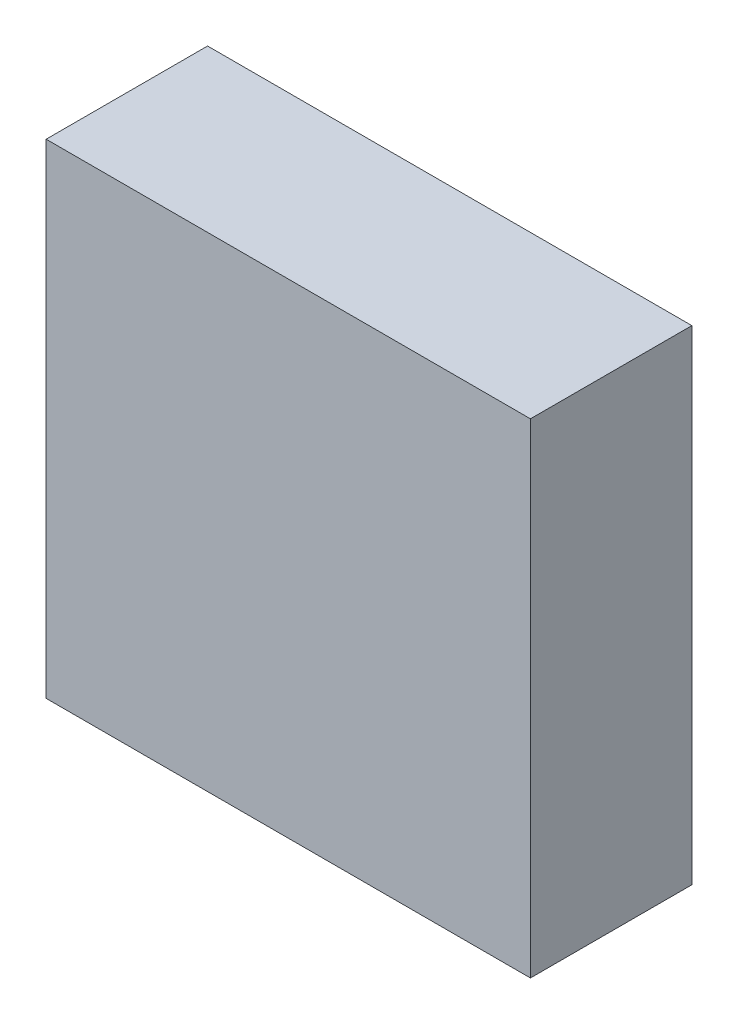
ISO-10303-21;
HEADER;
FILE_DESCRIPTION(('STEP AP214'),'2;1');
FILE_NAME('part.step','',(''),(''),'','','');
FILE_SCHEMA(('AUTOMOTIVE_DESIGN { 1 0 10303 214 1 1 1 1 }'));
ENDSEC;
DATA;
#1=APPLICATION_CONTEXT('core data for automotive mechanical design processes');
#2=APPLICATION_PROTOCOL_DEFINITION('international standard','automotive_design',2000,#1);
#3=PRODUCT_CONTEXT('',#1,'mechanical');
#4=PRODUCT('Part','Part','',(#3));
#5=PRODUCT_RELATED_PRODUCT_CATEGORY('part','',(#4));
#6=PRODUCT_DEFINITION_FORMATION('','',#4);
#7=PRODUCT_DEFINITION_CONTEXT('part definition',#1,'design');
#8=PRODUCT_DEFINITION('design','',#6,#7);
#9=PRODUCT_DEFINITION_SHAPE('','',#8);
#10=(LENGTH_UNIT() NAMED_UNIT(*) SI_UNIT(.MILLI.,.METRE.));
#11=(NAMED_UNIT(*) PLANE_ANGLE_UNIT() SI_UNIT($,.RADIAN.));
#12=(NAMED_UNIT(*) SI_UNIT($,.STERADIAN.) SOLID_ANGLE_UNIT());
#13=UNCERTAINTY_MEASURE_WITH_UNIT(LENGTH_MEASURE(1.E-05),#10,'distance_accuracy_value','');
#14=(GEOMETRIC_REPRESENTATION_CONTEXT(3) GLOBAL_UNCERTAINTY_ASSIGNED_CONTEXT((#13)) GLOBAL_UNIT_ASSIGNED_CONTEXT((#10,
#11,#12)) REPRESENTATION_CONTEXT('',''));
#15=CARTESIAN_POINT('',(0.,0.,0.));
#16=DIRECTION('',(0.,0.,1.));
#17=DIRECTION('',(1.,0.,0.));
#18=AXIS2_PLACEMENT_3D('',#15,#16,#17);
#19=CARTESIAN_POINT('',(-15.,80.,-15.));
#20=DIRECTION('',(1.,0.,0.));
#21=DIRECTION('',(0.,0.,-1.));
#22=AXIS2_PLACEMENT_3D('',#19,#20,#21);
#23=PLANE('',#22);
#24=DIRECTION('',(0.,-1.,0.));
#25=VECTOR('',#24,1.);
#26=CARTESIAN_POINT('',(-15.,80.,-15.));
#27=LINE('',#26,#25);
#28=CARTESIAN_POINT('',(-15.,85.,-15.));
#29=VERTEX_POINT('',#28);
#30=CARTESIAN_POINT('',(-15.,-5.,-15.));
#31=VERTEX_POINT('',#30);
#32=EDGE_CURVE('E202',#29,#31,#27,.T.);
#33=ORIENTED_EDGE('',*,*,#32,.T.);
#34=DIRECTION('',(0.,0.,-1.));
#35=VECTOR('',#34,1.);
#36=CARTESIAN_POINT('',(-15.,-5.,-15.));
#37=LINE('',#36,#35);
#38=CARTESIAN_POINT('',(-15.,-5.,15.));
#39=VERTEX_POINT('',#38);
#40=EDGE_CURVE('E166',#39,#31,#37,.T.);
#41=ORIENTED_EDGE('',*,*,#40,.F.);
#42=DIRECTION('',(0.,-1.,0.));
#43=VECTOR('',#42,1.);
#44=CARTESIAN_POINT('',(-15.,80.,15.));
#45=LINE('',#44,#43);
#46=CARTESIAN_POINT('',(-15.,85.,15.));
#47=VERTEX_POINT('',#46);
#48=EDGE_CURVE('E208',#47,#39,#45,.T.);
#49=ORIENTED_EDGE('',*,*,#48,.F.);
#50=DIRECTION('',(0.,0.,1.));
#51=VECTOR('',#50,1.);
#52=CARTESIAN_POINT('',(-15.,85.,-15.));
#53=LINE('',#52,#51);
#54=EDGE_CURVE('E172',#29,#47,#53,.T.);
#55=ORIENTED_EDGE('',*,*,#54,.F.);
#56=EDGE_LOOP('',(#33,#41,#49,#55));
#57=FACE_BOUND('',#56,.T.);
#58=ADVANCED_FACE('F38',(#57),#23,.F.);
#59=CARTESIAN_POINT('',(-15.,80.,15.));
#60=DIRECTION('',(0.,0.,-1.));
#61=DIRECTION('',(-1.,0.,0.));
#62=AXIS2_PLACEMENT_3D('',#59,#60,#61);
#63=PLANE('',#62);
#64=ORIENTED_EDGE('',*,*,#48,.T.);
#65=DIRECTION('',(-1.,0.,0.));
#66=VECTOR('',#65,1.);
#67=CARTESIAN_POINT('',(75.,-5.,15.));
#68=LINE('',#67,#66);
#69=CARTESIAN_POINT('',(75.,-5.,15.));
#70=VERTEX_POINT('',#69);
#71=EDGE_CURVE('E163',#70,#39,#68,.T.);
#72=ORIENTED_EDGE('',*,*,#71,.F.);
#73=DIRECTION('',(0.,-1.,0.));
#74=VECTOR('',#73,1.);
#75=CARTESIAN_POINT('',(75.,80.,15.));
#76=LINE('',#75,#74);
#77=CARTESIAN_POINT('',(75.,85.,15.));
#78=VERTEX_POINT('',#77);
#79=EDGE_CURVE('E206',#78,#70,#76,.T.);
#80=ORIENTED_EDGE('',*,*,#79,.F.);
#81=DIRECTION('',(1.,0.,0.));
#82=VECTOR('',#81,1.);
#83=CARTESIAN_POINT('',(-15.,85.,15.));
#84=LINE('',#83,#82);
#85=EDGE_CURVE('E175',#47,#78,#84,.T.);
#86=ORIENTED_EDGE('',*,*,#85,.F.);
#87=EDGE_LOOP('',(#64,#72,#80,#86));
#88=FACE_BOUND('',#87,.T.);
#89=ADVANCED_FACE('F274',(#88),#63,.F.);
#90=CARTESIAN_POINT('',(75.,80.,-15.));
#91=DIRECTION('',(-1.,0.,0.));
#92=DIRECTION('',(0.,0.,1.));
#93=AXIS2_PLACEMENT_3D('',#90,#91,#92);
#94=PLANE('',#93);
#95=ORIENTED_EDGE('',*,*,#79,.T.);
#96=DIRECTION('',(0.,0.,1.));
#97=VECTOR('',#96,1.);
#98=CARTESIAN_POINT('',(75.,-5.,-15.));
#99=LINE('',#98,#97);
#100=CARTESIAN_POINT('',(75.,-5.,-15.));
#101=VERTEX_POINT('',#100);
#102=EDGE_CURVE('E160',#101,#70,#99,.T.);
#103=ORIENTED_EDGE('',*,*,#102,.F.);
#104=DIRECTION('',(0.,-1.,0.));
#105=VECTOR('',#104,1.);
#106=CARTESIAN_POINT('',(75.,80.,-15.));
#107=LINE('',#106,#105);
#108=CARTESIAN_POINT('',(75.,85.,-15.));
#109=VERTEX_POINT('',#108);
#110=EDGE_CURVE('E204',#109,#101,#107,.T.);
#111=ORIENTED_EDGE('',*,*,#110,.F.);
#112=DIRECTION('',(0.,0.,-1.));
#113=VECTOR('',#112,1.);
#114=CARTESIAN_POINT('',(75.,85.,-15.));
#115=LINE('',#114,#113);
#116=EDGE_CURVE('E178',#78,#109,#115,.T.);
#117=ORIENTED_EDGE('',*,*,#116,.F.);
#118=EDGE_LOOP('',(#95,#103,#111,#117));
#119=FACE_BOUND('',#118,.T.);
#120=ADVANCED_FACE('F280',(#119),#94,.F.);
#121=CARTESIAN_POINT('',(-15.,80.,-15.));
#122=DIRECTION('',(0.,0.,1.));
#123=DIRECTION('',(1.,0.,0.));
#124=AXIS2_PLACEMENT_3D('',#121,#122,#123);
#125=PLANE('',#124);
#126=DIRECTION('',(-1.,0.,0.));
#127=VECTOR('',#126,1.);
#128=CARTESIAN_POINT('',(70.585,3.,-15.));
#129=LINE('',#128,#127);
#130=CARTESIAN_POINT('',(70.585,3.,-15.));
#131=VERTEX_POINT('',#130);
#132=CARTESIAN_POINT('',(-10.585,3.,-15.));
#133=VERTEX_POINT('',#132);
#134=EDGE_CURVE('E131',#131,#133,#129,.T.);
#135=ORIENTED_EDGE('',*,*,#134,.F.);
#136=DIRECTION('',(0.,-1.,0.));
#137=VECTOR('',#136,1.);
#138=CARTESIAN_POINT('',(70.585,3.,-15.));
#139=LINE('',#138,#137);
#140=CARTESIAN_POINT('',(70.585,77.,-15.));
#141=VERTEX_POINT('',#140);
#142=EDGE_CURVE('E52',#141,#131,#139,.T.);
#143=ORIENTED_EDGE('',*,*,#142,.F.);
#144=DIRECTION('',(1.,0.,0.));
#145=VECTOR('',#144,1.);
#146=CARTESIAN_POINT('',(70.585,77.,-15.));
#147=LINE('',#146,#145);
#148=CARTESIAN_POINT('',(-10.585,77.,-15.));
#149=VERTEX_POINT('',#148);
#150=EDGE_CURVE('E235',#149,#141,#147,.T.);
#151=ORIENTED_EDGE('',*,*,#150,.F.);
#152=DIRECTION('',(0.,1.,0.));
#153=VECTOR('',#152,1.);
#154=CARTESIAN_POINT('',(-10.585,3.,-15.));
#155=LINE('',#154,#153);
#156=EDGE_CURVE('E240',#133,#149,#155,.T.);
#157=ORIENTED_EDGE('',*,*,#156,.F.);
#158=EDGE_LOOP('',(#135,#143,#151,#157));
#159=FACE_BOUND('',#158,.T.);
#160=ORIENTED_EDGE('',*,*,#110,.T.);
#161=DIRECTION('',(1.,0.,0.));
#162=VECTOR('',#161,1.);
#163=CARTESIAN_POINT('',(75.,-5.,-15.));
#164=LINE('',#163,#162);
#165=EDGE_CURVE('E169',#31,#101,#164,.T.);
#166=ORIENTED_EDGE('',*,*,#165,.F.);
#167=ORIENTED_EDGE('',*,*,#32,.F.);
#168=DIRECTION('',(-1.,0.,0.));
#169=VECTOR('',#168,1.);
#170=CARTESIAN_POINT('',(-15.,85.,-15.));
#171=LINE('',#170,#169);
#172=EDGE_CURVE('E181',#109,#29,#171,.T.);
#173=ORIENTED_EDGE('',*,*,#172,.F.);
#174=EDGE_LOOP('',(#160,#166,#167,#173));
#175=FACE_BOUND('',#174,.T.);
#176=ADVANCED_FACE('F258',(#159,#175),#125,.F.);
#177=CARTESIAN_POINT('',(0.,85.,0.));
#178=DIRECTION('',(0.,1.,0.));
#179=DIRECTION('',(0.,0.,1.));
#180=AXIS2_PLACEMENT_3D('',#177,#178,#179);
#181=PLANE('',#180);
#182=ORIENTED_EDGE('',*,*,#54,.T.);
#183=ORIENTED_EDGE('',*,*,#85,.T.);
#184=ORIENTED_EDGE('',*,*,#116,.T.);
#185=ORIENTED_EDGE('',*,*,#172,.T.);
#186=EDGE_LOOP('',(#182,#183,#184,#185));
#187=FACE_BOUND('',#186,.T.);
#188=ADVANCED_FACE('F292',(#187),#181,.T.);
#189=CARTESIAN_POINT('',(0.,-5.,0.));
#190=DIRECTION('',(0.,-1.,0.));
#191=DIRECTION('',(0.,0.,-1.));
#192=AXIS2_PLACEMENT_3D('',#189,#190,#191);
#193=PLANE('',#192);
#194=ORIENTED_EDGE('',*,*,#102,.T.);
#195=ORIENTED_EDGE('',*,*,#71,.T.);
#196=ORIENTED_EDGE('',*,*,#40,.T.);
#197=ORIENTED_EDGE('',*,*,#165,.T.);
#198=EDGE_LOOP('',(#194,#195,#196,#197));
#199=FACE_BOUND('',#198,.T.);
#200=ADVANCED_FACE('F269',(#199),#193,.T.);
#201=CARTESIAN_POINT('',(0.,0.,0.));
#202=DIRECTION('',(0.,0.,1.));
#203=DIRECTION('',(1.,0.,0.));
#204=AXIS2_PLACEMENT_3D('',#201,#202,#203);
#205=PLANE('',#204);
#206=DIRECTION('',(0.,-1.,0.));
#207=VECTOR('',#206,1.);
#208=CARTESIAN_POINT('',(10.585,80.,0.));
#209=LINE('',#208,#207);
#210=CARTESIAN_POINT('',(10.585,3.,0.));
#211=VERTEX_POINT('',#210);
#212=CARTESIAN_POINT('',(10.585,77.,0.));
#213=VERTEX_POINT('',#212);
#214=EDGE_CURVE('E149',#211,#213,#209,.F.);
#215=ORIENTED_EDGE('',*,*,#214,.T.);
#216=DIRECTION('',(1.,0.,0.));
#217=VECTOR('',#216,1.);
#218=CARTESIAN_POINT('',(70.585,77.,0.));
#219=LINE('',#218,#217);
#220=CARTESIAN_POINT('',(19.415,77.,0.));
#221=VERTEX_POINT('',#220);
#222=EDGE_CURVE('E220',#213,#221,#219,.T.);
#223=ORIENTED_EDGE('',*,*,#222,.T.);
#224=DIRECTION('',(0.,-1.,0.));
#225=VECTOR('',#224,1.);
#226=CARTESIAN_POINT('',(19.415,80.,0.));
#227=LINE('',#226,#225);
#228=CARTESIAN_POINT('',(19.415,3.,0.));
#229=VERTEX_POINT('',#228);
#230=EDGE_CURVE('E11',#221,#229,#227,.T.);
#231=ORIENTED_EDGE('',*,*,#230,.T.);
#232=DIRECTION('',(-1.,0.,0.));
#233=VECTOR('',#232,1.);
#234=CARTESIAN_POINT('',(70.585,3.,0.));
#235=LINE('',#234,#233);
#236=EDGE_CURVE('E59',#229,#211,#235,.T.);
#237=ORIENTED_EDGE('',*,*,#236,.T.);
#238=EDGE_LOOP('',(#215,#223,#231,#237));
#239=FACE_BOUND('',#238,.T.);
#240=ADVANCED_FACE('F225',(#239),#205,.F.);
#241=CARTESIAN_POINT('',(70.585,3.,0.));
#242=DIRECTION('',(1.,0.,0.));
#243=DIRECTION('',(0.,0.,-1.));
#244=AXIS2_PLACEMENT_3D('',#241,#242,#243);
#245=PLANE('',#244);
#246=ORIENTED_EDGE('',*,*,#142,.T.);
#247=DIRECTION('',(0.,0.,-1.));
#248=VECTOR('',#247,1.);
#249=CARTESIAN_POINT('',(70.585,3.,0.));
#250=LINE('',#249,#248);
#251=CARTESIAN_POINT('',(70.585,3.,0.));
#252=VERTEX_POINT('',#251);
#253=EDGE_CURVE('E136',#252,#131,#250,.T.);
#254=ORIENTED_EDGE('',*,*,#253,.F.);
#255=DIRECTION('',(0.,-1.,0.));
#256=VECTOR('',#255,1.);
#257=CARTESIAN_POINT('',(70.585,3.,0.));
#258=LINE('',#257,#256);
#259=CARTESIAN_POINT('',(70.585,77.,0.));
#260=VERTEX_POINT('',#259);
#261=EDGE_CURVE('E232',#260,#252,#258,.T.);
#262=ORIENTED_EDGE('',*,*,#261,.F.);
#263=DIRECTION('',(0.,0.,-1.));
#264=VECTOR('',#263,1.);
#265=CARTESIAN_POINT('',(70.585,77.,0.));
#266=LINE('',#265,#264);
#267=EDGE_CURVE('E244',#260,#141,#266,.T.);
#268=ORIENTED_EDGE('',*,*,#267,.T.);
#269=EDGE_LOOP('',(#246,#254,#262,#268));
#270=FACE_BOUND('',#269,.T.);
#271=ADVANCED_FACE('F261',(#270),#245,.F.);
#272=CARTESIAN_POINT('',(70.585,77.,0.));
#273=DIRECTION('',(0.,1.,0.));
#274=DIRECTION('',(0.,0.,1.));
#275=AXIS2_PLACEMENT_3D('',#272,#273,#274);
#276=PLANE('',#275);
#277=CARTESIAN_POINT('',(0.,77.,0.));
#278=DIRECTION('',(0.,1.,0.));
#279=DIRECTION('',(0.,0.,1.));
#280=AXIS2_PLACEMENT_3D('',#277,#278,#279);
#281=CIRCLE('',#280,10.585);
#282=CARTESIAN_POINT('',(-10.585,77.,0.));
#283=VERTEX_POINT('',#282);
#284=EDGE_CURVE('E153',#213,#283,#281,.T.);
#285=ORIENTED_EDGE('',*,*,#284,.T.);
#286=DIRECTION('',(0.,0.,-1.));
#287=VECTOR('',#286,1.);
#288=CARTESIAN_POINT('',(-10.585,77.,0.));
#289=LINE('',#288,#287);
#290=EDGE_CURVE('E135',#283,#149,#289,.T.);
#291=ORIENTED_EDGE('',*,*,#290,.T.);
#292=ORIENTED_EDGE('',*,*,#150,.T.);
#293=ORIENTED_EDGE('',*,*,#267,.F.);
#294=CARTESIAN_POINT('',(60.,77.,0.));
#295=DIRECTION('',(0.,1.,0.));
#296=DIRECTION('',(0.,0.,1.));
#297=AXIS2_PLACEMENT_3D('',#294,#295,#296);
#298=CIRCLE('',#297,10.585);
#299=CARTESIAN_POINT('',(49.415,77.,0.));
#300=VERTEX_POINT('',#299);
#301=EDGE_CURVE('E150',#260,#300,#298,.T.);
#302=ORIENTED_EDGE('',*,*,#301,.T.);
#303=CARTESIAN_POINT('',(40.585,77.,0.));
#304=VERTEX_POINT('',#303);
#305=EDGE_CURVE('E144',#304,#300,#219,.T.);
#306=ORIENTED_EDGE('',*,*,#305,.F.);
#307=CARTESIAN_POINT('',(30.,77.,0.));
#308=DIRECTION('',(0.,1.,0.));
#309=DIRECTION('',(0.,0.,1.));
#310=AXIS2_PLACEMENT_3D('',#307,#308,#309);
#311=CIRCLE('',#310,10.585);
#312=EDGE_CURVE('E45',#304,#221,#311,.T.);
#313=ORIENTED_EDGE('',*,*,#312,.T.);
#314=ORIENTED_EDGE('',*,*,#222,.F.);
#315=EDGE_LOOP('',(#285,#291,#292,#293,#302,#306,#313,#314));
#316=FACE_BOUND('',#315,.T.);
#317=ADVANCED_FACE('F219',(#316),#276,.F.);
#318=CARTESIAN_POINT('',(-10.585,3.,0.));
#319=DIRECTION('',(-1.,0.,0.));
#320=DIRECTION('',(0.,0.,1.));
#321=AXIS2_PLACEMENT_3D('',#318,#319,#320);
#322=PLANE('',#321);
#323=ORIENTED_EDGE('',*,*,#156,.T.);
#324=ORIENTED_EDGE('',*,*,#290,.F.);
#325=DIRECTION('',(0.,1.,0.));
#326=VECTOR('',#325,1.);
#327=CARTESIAN_POINT('',(-10.585,3.,0.));
#328=LINE('',#327,#326);
#329=CARTESIAN_POINT('',(-10.585,3.,0.));
#330=VERTEX_POINT('',#329);
#331=EDGE_CURVE('E140',#330,#283,#328,.T.);
#332=ORIENTED_EDGE('',*,*,#331,.F.);
#333=DIRECTION('',(0.,0.,-1.));
#334=VECTOR('',#333,1.);
#335=CARTESIAN_POINT('',(-10.585,3.,0.));
#336=LINE('',#335,#334);
#337=EDGE_CURVE('E124',#330,#133,#336,.T.);
#338=ORIENTED_EDGE('',*,*,#337,.T.);
#339=EDGE_LOOP('',(#323,#324,#332,#338));
#340=FACE_BOUND('',#339,.T.);
#341=ADVANCED_FACE('F141',(#340),#322,.F.);
#342=CARTESIAN_POINT('',(70.585,3.,0.));
#343=DIRECTION('',(0.,-1.,0.));
#344=DIRECTION('',(0.,0.,-1.));
#345=AXIS2_PLACEMENT_3D('',#342,#343,#344);
#346=PLANE('',#345);
#347=CARTESIAN_POINT('',(0.,3.,0.));
#348=DIRECTION('',(0.,-1.,0.));
#349=DIRECTION('',(0.,0.,-1.));
#350=AXIS2_PLACEMENT_3D('',#347,#348,#349);
#351=CIRCLE('',#350,10.585);
#352=EDGE_CURVE('E128',#330,#211,#351,.T.);
#353=ORIENTED_EDGE('',*,*,#352,.T.);
#354=ORIENTED_EDGE('',*,*,#236,.F.);
#355=CARTESIAN_POINT('',(30.,3.,0.));
#356=DIRECTION('',(0.,-1.,0.));
#357=DIRECTION('',(0.,0.,-1.));
#358=AXIS2_PLACEMENT_3D('',#355,#356,#357);
#359=CIRCLE('',#358,10.585);
#360=CARTESIAN_POINT('',(40.585,3.,0.));
#361=VERTEX_POINT('',#360);
#362=EDGE_CURVE('E212',#229,#361,#359,.T.);
#363=ORIENTED_EDGE('',*,*,#362,.T.);
#364=CARTESIAN_POINT('',(49.415,3.,0.));
#365=VERTEX_POINT('',#364);
#366=EDGE_CURVE('E145',#365,#361,#235,.T.);
#367=ORIENTED_EDGE('',*,*,#366,.F.);
#368=CARTESIAN_POINT('',(60.,3.,0.));
#369=DIRECTION('',(0.,-1.,0.));
#370=DIRECTION('',(0.,0.,-1.));
#371=AXIS2_PLACEMENT_3D('',#368,#369,#370);
#372=CIRCLE('',#371,10.585);
#373=EDGE_CURVE('E151',#365,#252,#372,.T.);
#374=ORIENTED_EDGE('',*,*,#373,.T.);
#375=ORIENTED_EDGE('',*,*,#253,.T.);
#376=ORIENTED_EDGE('',*,*,#134,.T.);
#377=ORIENTED_EDGE('',*,*,#337,.F.);
#378=EDGE_LOOP('',(#353,#354,#363,#367,#374,#375,#376,#377));
#379=FACE_BOUND('',#378,.T.);
#380=ADVANCED_FACE('F126',(#379),#346,.F.);
#381=DIRECTION('',(0.,-1.,0.));
#382=VECTOR('',#381,1.);
#383=CARTESIAN_POINT('',(49.415,80.,0.));
#384=LINE('',#383,#382);
#385=EDGE_CURVE('E246',#300,#365,#384,.T.);
#386=ORIENTED_EDGE('',*,*,#385,.T.);
#387=ORIENTED_EDGE('',*,*,#366,.T.);
#388=DIRECTION('',(0.,-1.,0.));
#389=VECTOR('',#388,1.);
#390=CARTESIAN_POINT('',(40.585,80.,0.));
#391=LINE('',#390,#389);
#392=EDGE_CURVE('E210',#361,#304,#391,.F.);
#393=ORIENTED_EDGE('',*,*,#392,.T.);
#394=ORIENTED_EDGE('',*,*,#305,.T.);
#395=EDGE_LOOP('',(#386,#387,#393,#394));
#396=FACE_BOUND('',#395,.T.);
#397=ADVANCED_FACE('F251',(#396),#205,.F.);
#398=CARTESIAN_POINT('',(0.,0.,0.));
#399=DIRECTION('',(0.,-1.,0.));
#400=DIRECTION('',(0.,0.,-1.));
#401=AXIS2_PLACEMENT_3D('',#398,#399,#400);
#402=PLANE('',#401);
#403=CARTESIAN_POINT('',(60.,0.,0.));
#404=DIRECTION('',(0.,1.,0.));
#405=DIRECTION('',(0.,0.,1.));
#406=AXIS2_PLACEMENT_3D('',#403,#404,#405);
#407=CIRCLE('',#406,10.585);
#408=CARTESIAN_POINT('',(60.,0.,10.585));
#409=VERTEX_POINT('',#408);
#410=EDGE_CURVE('E191',#409,#409,#407,.T.);
#411=ORIENTED_EDGE('',*,*,#410,.T.);
#412=EDGE_LOOP('',(#411));
#413=FACE_BOUND('',#412,.T.);
#414=ADVANCED_FACE('F307',(#413),#402,.F.);
#415=CARTESIAN_POINT('',(0.,80.,0.));
#416=DIRECTION('',(0.,1.,0.));
#417=DIRECTION('',(0.,0.,1.));
#418=AXIS2_PLACEMENT_3D('',#415,#416,#417);
#419=PLANE('',#418);
#420=CARTESIAN_POINT('',(60.,80.,0.));
#421=DIRECTION('',(0.,1.,0.));
#422=DIRECTION('',(0.,0.,1.));
#423=AXIS2_PLACEMENT_3D('',#420,#421,#422);
#424=CIRCLE('',#423,10.585);
#425=CARTESIAN_POINT('',(60.,80.,10.585));
#426=VERTEX_POINT('',#425);
#427=EDGE_CURVE('E192',#426,#426,#424,.T.);
#428=ORIENTED_EDGE('',*,*,#427,.F.);
#429=EDGE_LOOP('',(#428));
#430=FACE_BOUND('',#429,.T.);
#431=ADVANCED_FACE('F304',(#430),#419,.F.);
#432=CARTESIAN_POINT('',(60.,80.,0.));
#433=DIRECTION('',(0.,-1.,0.));
#434=DIRECTION('',(0.,0.,-1.));
#435=AXIS2_PLACEMENT_3D('',#432,#433,#434);
#436=CYLINDRICAL_SURFACE('',#435,10.585);
#437=ORIENTED_EDGE('',*,*,#385,.F.);
#438=ORIENTED_EDGE('',*,*,#301,.F.);
#439=ORIENTED_EDGE('',*,*,#261,.T.);
#440=ORIENTED_EDGE('',*,*,#373,.F.);
#441=EDGE_LOOP('',(#437,#438,#439,#440));
#442=FACE_BOUND('',#441,.T.);
#443=ORIENTED_EDGE('',*,*,#427,.T.);
#444=EDGE_LOOP('',(#443));
#445=FACE_BOUND('',#444,.T.);
#446=ORIENTED_EDGE('',*,*,#410,.F.);
#447=EDGE_LOOP('',(#446));
#448=FACE_BOUND('',#447,.T.);
#449=ADVANCED_FACE('F254',(#442,#445,#448),#436,.F.);
#450=CARTESIAN_POINT('',(0.,0.,0.));
#451=DIRECTION('',(0.,1.,0.));
#452=DIRECTION('',(0.,0.,1.));
#453=AXIS2_PLACEMENT_3D('',#450,#451,#452);
#454=CIRCLE('',#453,10.585);
#455=CARTESIAN_POINT('',(0.,0.,10.585));
#456=VERTEX_POINT('',#455);
#457=EDGE_CURVE('E197',#456,#456,#454,.T.);
#458=ORIENTED_EDGE('',*,*,#457,.T.);
#459=EDGE_LOOP('',(#458));
#460=FACE_BOUND('',#459,.T.);
#461=ADVANCED_FACE('F303',(#460),#402,.F.);
#462=CARTESIAN_POINT('',(0.,80.,0.));
#463=DIRECTION('',(0.,1.,0.));
#464=DIRECTION('',(0.,0.,1.));
#465=AXIS2_PLACEMENT_3D('',#462,#463,#464);
#466=CIRCLE('',#465,10.585);
#467=CARTESIAN_POINT('',(0.,80.,10.585));
#468=VERTEX_POINT('',#467);
#469=EDGE_CURVE('E187',#468,#468,#466,.T.);
#470=ORIENTED_EDGE('',*,*,#469,.F.);
#471=EDGE_LOOP('',(#470));
#472=FACE_BOUND('',#471,.T.);
#473=ADVANCED_FACE('F309',(#472),#419,.F.);
#474=CARTESIAN_POINT('',(0.,80.,0.));
#475=DIRECTION('',(0.,-1.,0.));
#476=DIRECTION('',(0.,0.,-1.));
#477=AXIS2_PLACEMENT_3D('',#474,#475,#476);
#478=CYLINDRICAL_SURFACE('',#477,10.585);
#479=ORIENTED_EDGE('',*,*,#284,.F.);
#480=ORIENTED_EDGE('',*,*,#214,.F.);
#481=ORIENTED_EDGE('',*,*,#352,.F.);
#482=ORIENTED_EDGE('',*,*,#331,.T.);
#483=EDGE_LOOP('',(#479,#480,#481,#482));
#484=FACE_BOUND('',#483,.T.);
#485=ORIENTED_EDGE('',*,*,#469,.T.);
#486=EDGE_LOOP('',(#485));
#487=FACE_BOUND('',#486,.T.);
#488=ORIENTED_EDGE('',*,*,#457,.F.);
#489=EDGE_LOOP('',(#488));
#490=FACE_BOUND('',#489,.T.);
#491=ADVANCED_FACE('F147',(#484,#487,#490),#478,.F.);
#492=CARTESIAN_POINT('',(30.,0.,0.));
#493=DIRECTION('',(0.,1.,0.));
#494=DIRECTION('',(0.,0.,1.));
#495=AXIS2_PLACEMENT_3D('',#492,#493,#494);
#496=CIRCLE('',#495,10.585);
#497=CARTESIAN_POINT('',(30.,0.,10.585));
#498=VERTEX_POINT('',#497);
#499=EDGE_CURVE('E188',#498,#498,#496,.T.);
#500=ORIENTED_EDGE('',*,*,#499,.T.);
#501=EDGE_LOOP('',(#500));
#502=FACE_BOUND('',#501,.T.);
#503=ADVANCED_FACE('F316',(#502),#402,.F.);
#504=CARTESIAN_POINT('',(30.,80.,0.));
#505=DIRECTION('',(0.,1.,0.));
#506=DIRECTION('',(0.,0.,1.));
#507=AXIS2_PLACEMENT_3D('',#504,#505,#506);
#508=CIRCLE('',#507,10.585);
#509=CARTESIAN_POINT('',(30.,80.,10.585));
#510=VERTEX_POINT('',#509);
#511=EDGE_CURVE('E184',#510,#510,#508,.T.);
#512=ORIENTED_EDGE('',*,*,#511,.F.);
#513=EDGE_LOOP('',(#512));
#514=FACE_BOUND('',#513,.T.);
#515=ADVANCED_FACE('F310',(#514),#419,.F.);
#516=CARTESIAN_POINT('',(30.,80.,0.));
#517=DIRECTION('',(0.,-1.,0.));
#518=DIRECTION('',(0.,0.,-1.));
#519=AXIS2_PLACEMENT_3D('',#516,#517,#518);
#520=CYLINDRICAL_SURFACE('',#519,10.585);
#521=ORIENTED_EDGE('',*,*,#230,.F.);
#522=ORIENTED_EDGE('',*,*,#312,.F.);
#523=ORIENTED_EDGE('',*,*,#392,.F.);
#524=ORIENTED_EDGE('',*,*,#362,.F.);
#525=EDGE_LOOP('',(#521,#522,#523,#524));
#526=FACE_BOUND('',#525,.T.);
#527=ORIENTED_EDGE('',*,*,#511,.T.);
#528=EDGE_LOOP('',(#527));
#529=FACE_BOUND('',#528,.T.);
#530=ORIENTED_EDGE('',*,*,#499,.F.);
#531=EDGE_LOOP('',(#530));
#532=FACE_BOUND('',#531,.T.);
#533=ADVANCED_FACE('F228',(#526,#529,#532),#520,.F.);
#534=CLOSED_SHELL('',(#58,#89,#120,#176,#188,#200,#240,#271,#317,#341,#380,#397,#414,#431,#449,
#461,#473,#491,#503,#515,#533));
#535=MANIFOLD_SOLID_BREP('B2',#534);
#536=ADVANCED_BREP_SHAPE_REPRESENTATION('',(#18,#535),#14);
#537=SHAPE_DEFINITION_REPRESENTATION(#9,#536);
ENDSEC;
END-ISO-10303-21;
